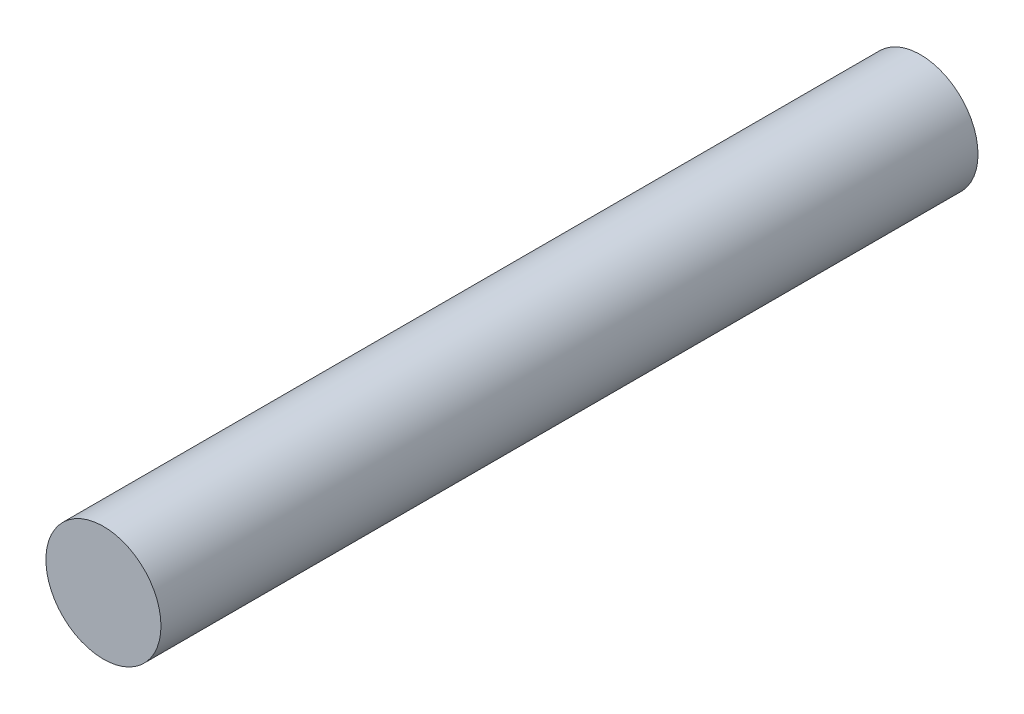
ISO-10303-21;
HEADER;
FILE_DESCRIPTION(('STEP AP214'),'2;1');
FILE_NAME('part.step','',(''),(''),'','','');
FILE_SCHEMA(('AUTOMOTIVE_DESIGN { 1 0 10303 214 1 1 1 1 }'));
ENDSEC;
DATA;
#1=APPLICATION_CONTEXT('core data for automotive mechanical design processes');
#2=APPLICATION_PROTOCOL_DEFINITION('international standard','automotive_design',2000,#1);
#3=PRODUCT_CONTEXT('',#1,'mechanical');
#4=PRODUCT('Part','Part','',(#3));
#5=PRODUCT_RELATED_PRODUCT_CATEGORY('part','',(#4));
#6=PRODUCT_DEFINITION_FORMATION('','',#4);
#7=PRODUCT_DEFINITION_CONTEXT('part definition',#1,'design');
#8=PRODUCT_DEFINITION('design','',#6,#7);
#9=PRODUCT_DEFINITION_SHAPE('','',#8);
#10=(LENGTH_UNIT() NAMED_UNIT(*) SI_UNIT(.MILLI.,.METRE.));
#11=(NAMED_UNIT(*) PLANE_ANGLE_UNIT() SI_UNIT($,.RADIAN.));
#12=(NAMED_UNIT(*) SI_UNIT($,.STERADIAN.) SOLID_ANGLE_UNIT());
#13=UNCERTAINTY_MEASURE_WITH_UNIT(LENGTH_MEASURE(1.E-05),#10,'distance_accuracy_value','');
#14=(GEOMETRIC_REPRESENTATION_CONTEXT(3) GLOBAL_UNCERTAINTY_ASSIGNED_CONTEXT((#13)) GLOBAL_UNIT_ASSIGNED_CONTEXT((#10,
#11,#12)) REPRESENTATION_CONTEXT('',''));
#15=CARTESIAN_POINT('',(0.,0.,0.));
#16=DIRECTION('',(0.,0.,1.));
#17=DIRECTION('',(1.,0.,0.));
#18=AXIS2_PLACEMENT_3D('',#15,#16,#17);
#19=CARTESIAN_POINT('',(0.,0.,56.8));
#20=DIRECTION('',(0.,0.,-1.));
#21=DIRECTION('',(-1.,0.,0.));
#22=AXIS2_PLACEMENT_3D('',#19,#20,#21);
#23=CYLINDRICAL_SURFACE('',#22,4.);
#24=CARTESIAN_POINT('',(0.,0.,56.8));
#25=DIRECTION('',(0.,0.,1.));
#26=DIRECTION('',(1.,0.,0.));
#27=AXIS2_PLACEMENT_3D('',#24,#25,#26);
#28=CIRCLE('',#27,4.);
#29=CARTESIAN_POINT('',(4.,0.,56.8));
#30=VERTEX_POINT('',#29);
#31=EDGE_CURVE('E10',#30,#30,#28,.T.);
#32=ORIENTED_EDGE('',*,*,#31,.F.);
#33=EDGE_LOOP('',(#32));
#34=FACE_BOUND('',#33,.T.);
#35=CARTESIAN_POINT('',(0.,0.,0.));
#36=DIRECTION('',(0.,0.,1.));
#37=DIRECTION('',(1.,0.,0.));
#38=AXIS2_PLACEMENT_3D('',#35,#36,#37);
#39=CIRCLE('',#38,4.);
#40=CARTESIAN_POINT('',(4.,0.,0.));
#41=VERTEX_POINT('',#40);
#42=EDGE_CURVE('E35',#41,#41,#39,.T.);
#43=ORIENTED_EDGE('',*,*,#42,.T.);
#44=EDGE_LOOP('',(#43));
#45=FACE_BOUND('',#44,.T.);
#46=ADVANCED_FACE('F32',(#34,#45),#23,.T.);
#47=CARTESIAN_POINT('',(0.,0.,56.8));
#48=DIRECTION('',(0.,0.,1.));
#49=DIRECTION('',(1.,0.,0.));
#50=AXIS2_PLACEMENT_3D('',#47,#48,#49);
#51=PLANE('',#50);
#52=ORIENTED_EDGE('',*,*,#31,.T.);
#53=EDGE_LOOP('',(#52));
#54=FACE_BOUND('',#53,.T.);
#55=ADVANCED_FACE('F47',(#54),#51,.T.);
#56=CARTESIAN_POINT('',(0.,0.,0.));
#57=DIRECTION('',(0.,0.,1.));
#58=DIRECTION('',(1.,0.,0.));
#59=AXIS2_PLACEMENT_3D('',#56,#57,#58);
#60=PLANE('',#59);
#61=ORIENTED_EDGE('',*,*,#42,.F.);
#62=EDGE_LOOP('',(#61));
#63=FACE_BOUND('',#62,.T.);
#64=ADVANCED_FACE('F45',(#63),#60,.F.);
#65=CLOSED_SHELL('',(#46,#55,#64));
#66=MANIFOLD_SOLID_BREP('B2',#65);
#67=ADVANCED_BREP_SHAPE_REPRESENTATION('',(#18,#66),#14);
#68=SHAPE_DEFINITION_REPRESENTATION(#9,#67);
ENDSEC;
END-ISO-10303-21;
